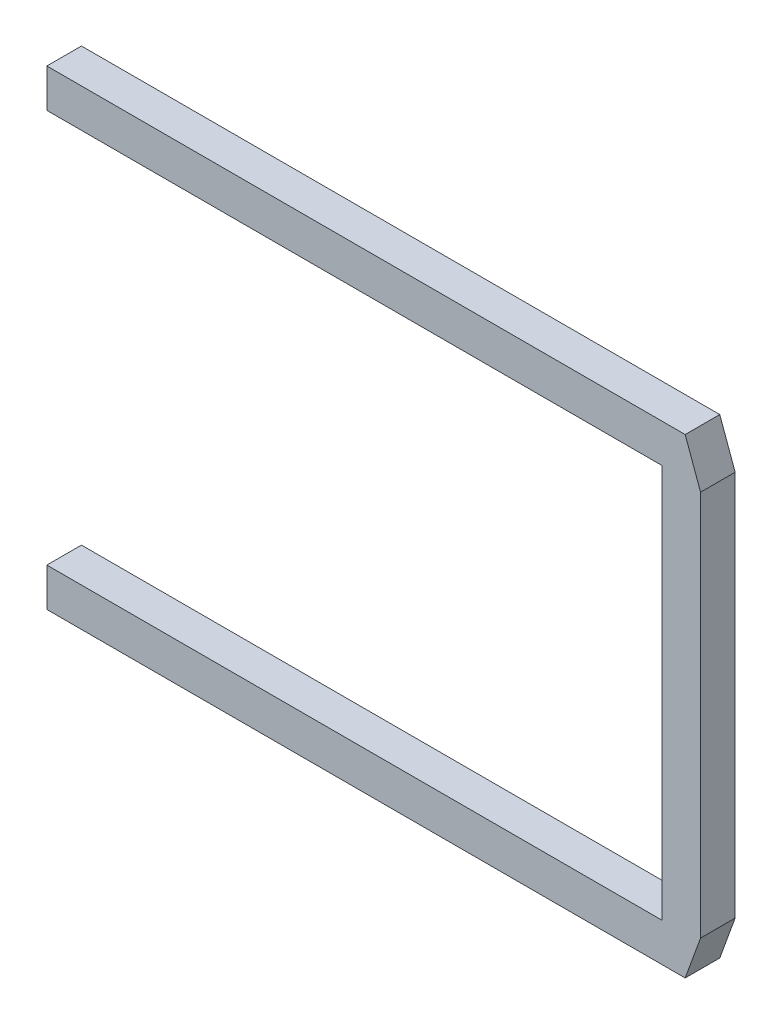
ISO-10303-21;
HEADER;
FILE_DESCRIPTION(('STEP AP214'),'2;1');
FILE_NAME('part.step','',(''),(''),'','','');
FILE_SCHEMA(('AUTOMOTIVE_DESIGN { 1 0 10303 214 1 1 1 1 }'));
ENDSEC;
DATA;
#1=APPLICATION_CONTEXT('core data for automotive mechanical design processes');
#2=APPLICATION_PROTOCOL_DEFINITION('international standard','automotive_design',2000,#1);
#3=PRODUCT_CONTEXT('',#1,'mechanical');
#4=PRODUCT('Part','Part','',(#3));
#5=PRODUCT_RELATED_PRODUCT_CATEGORY('part','',(#4));
#6=PRODUCT_DEFINITION_FORMATION('','',#4);
#7=PRODUCT_DEFINITION_CONTEXT('part definition',#1,'design');
#8=PRODUCT_DEFINITION('design','',#6,#7);
#9=PRODUCT_DEFINITION_SHAPE('','',#8);
#10=(LENGTH_UNIT() NAMED_UNIT(*) SI_UNIT(.MILLI.,.METRE.));
#11=(NAMED_UNIT(*) PLANE_ANGLE_UNIT() SI_UNIT($,.RADIAN.));
#12=(NAMED_UNIT(*) SI_UNIT($,.STERADIAN.) SOLID_ANGLE_UNIT());
#13=UNCERTAINTY_MEASURE_WITH_UNIT(LENGTH_MEASURE(1.E-05),#10,'distance_accuracy_value','');
#14=(GEOMETRIC_REPRESENTATION_CONTEXT(3) GLOBAL_UNCERTAINTY_ASSIGNED_CONTEXT((#13)) GLOBAL_UNIT_ASSIGNED_CONTEXT((#10,
#11,#12)) REPRESENTATION_CONTEXT('',''));
#15=CARTESIAN_POINT('',(0.,0.,0.));
#16=DIRECTION('',(0.,0.,1.));
#17=DIRECTION('',(1.,0.,0.));
#18=AXIS2_PLACEMENT_3D('',#15,#16,#17);
#19=CARTESIAN_POINT('',(42.5,30.6,4.5));
#20=DIRECTION('',(-1.,0.,0.));
#21=DIRECTION('',(0.,-1.,0.));
#22=AXIS2_PLACEMENT_3D('',#19,#20,#21);
#23=PLANE('',#22);
#24=DIRECTION('',(0.,1.,0.));
#25=VECTOR('',#24,1.);
#26=CARTESIAN_POINT('',(42.5,30.6,4.5));
#27=LINE('',#26,#25);
#28=CARTESIAN_POINT('',(42.5,-25.1050451610908,4.5));
#29=VERTEX_POINT('',#28);
#30=CARTESIAN_POINT('',(42.5,25.1050451610907,4.5));
#31=VERTEX_POINT('',#30);
#32=EDGE_CURVE('E118',#29,#31,#27,.T.);
#33=ORIENTED_EDGE('',*,*,#32,.F.);
#34=DIRECTION('',(0.,0.,-1.));
#35=VECTOR('',#34,1.);
#36=CARTESIAN_POINT('',(42.5,-25.1050451610908,4.5));
#37=LINE('',#36,#35);
#38=CARTESIAN_POINT('',(42.5,-25.1050451610908,0.));
#39=VERTEX_POINT('',#38);
#40=EDGE_CURVE('E176',#29,#39,#37,.T.);
#41=ORIENTED_EDGE('',*,*,#40,.T.);
#42=DIRECTION('',(0.,1.,0.));
#43=VECTOR('',#42,1.);
#44=CARTESIAN_POINT('',(42.5,30.6,0.));
#45=LINE('',#44,#43);
#46=CARTESIAN_POINT('',(42.5,25.1050451610907,0.));
#47=VERTEX_POINT('',#46);
#48=EDGE_CURVE('E147',#39,#47,#45,.T.);
#49=ORIENTED_EDGE('',*,*,#48,.T.);
#50=DIRECTION('',(0.,0.,1.));
#51=VECTOR('',#50,1.);
#52=CARTESIAN_POINT('',(42.5,25.1050451610907,4.5));
#53=LINE('',#52,#51);
#54=EDGE_CURVE('E127',#47,#31,#53,.T.);
#55=ORIENTED_EDGE('',*,*,#54,.T.);
#56=EDGE_LOOP('',(#33,#41,#49,#55));
#57=FACE_BOUND('',#56,.T.);
#58=ADVANCED_FACE('F33',(#57),#23,.F.);
#59=CARTESIAN_POINT('',(-42.5,30.6,4.5));
#60=DIRECTION('',(0.,-1.,0.));
#61=DIRECTION('',(0.,0.,-1.));
#62=AXIS2_PLACEMENT_3D('',#59,#60,#61);
#63=PLANE('',#62);
#64=DIRECTION('',(-1.,0.,0.));
#65=VECTOR('',#64,1.);
#66=CARTESIAN_POINT('',(-42.5,30.6,4.5));
#67=LINE('',#66,#65);
#68=CARTESIAN_POINT('',(40.5,30.6,4.5));
#69=VERTEX_POINT('',#68);
#70=CARTESIAN_POINT('',(-42.5,30.6,4.5));
#71=VERTEX_POINT('',#70);
#72=EDGE_CURVE('E110',#69,#71,#67,.T.);
#73=ORIENTED_EDGE('',*,*,#72,.F.);
#74=DIRECTION('',(0.,0.,-1.));
#75=VECTOR('',#74,1.);
#76=CARTESIAN_POINT('',(40.5,30.6,4.5));
#77=LINE('',#76,#75);
#78=CARTESIAN_POINT('',(40.5,30.6,0.));
#79=VERTEX_POINT('',#78);
#80=EDGE_CURVE('E11',#69,#79,#77,.T.);
#81=ORIENTED_EDGE('',*,*,#80,.T.);
#82=DIRECTION('',(-1.,0.,0.));
#83=VECTOR('',#82,1.);
#84=CARTESIAN_POINT('',(-42.5,30.6,0.));
#85=LINE('',#84,#83);
#86=CARTESIAN_POINT('',(-42.5,30.6,0.));
#87=VERTEX_POINT('',#86);
#88=EDGE_CURVE('E124',#79,#87,#85,.T.);
#89=ORIENTED_EDGE('',*,*,#88,.T.);
#90=DIRECTION('',(0.,0.,-1.));
#91=VECTOR('',#90,1.);
#92=CARTESIAN_POINT('',(-42.5,30.6,4.5));
#93=LINE('',#92,#91);
#94=EDGE_CURVE('E121',#71,#87,#93,.T.);
#95=ORIENTED_EDGE('',*,*,#94,.F.);
#96=EDGE_LOOP('',(#73,#81,#89,#95));
#97=FACE_BOUND('',#96,.T.);
#98=ADVANCED_FACE('F122',(#97),#63,.F.);
#99=CARTESIAN_POINT('',(-42.5,30.6,4.5));
#100=DIRECTION('',(1.,0.,0.));
#101=DIRECTION('',(0.,1.,0.));
#102=AXIS2_PLACEMENT_3D('',#99,#100,#101);
#103=PLANE('',#102);
#104=DIRECTION('',(0.,-1.,0.));
#105=VECTOR('',#104,1.);
#106=CARTESIAN_POINT('',(-42.5,30.6,0.));
#107=LINE('',#106,#105);
#108=CARTESIAN_POINT('',(-42.5,25.6,0.));
#109=VERTEX_POINT('',#108);
#110=EDGE_CURVE('E151',#87,#109,#107,.T.);
#111=ORIENTED_EDGE('',*,*,#110,.T.);
#112=DIRECTION('',(0.,0.,-1.));
#113=VECTOR('',#112,1.);
#114=CARTESIAN_POINT('',(-42.5,25.6,4.5));
#115=LINE('',#114,#113);
#116=CARTESIAN_POINT('',(-42.5,25.6,4.5));
#117=VERTEX_POINT('',#116);
#118=EDGE_CURVE('E128',#117,#109,#115,.T.);
#119=ORIENTED_EDGE('',*,*,#118,.F.);
#120=DIRECTION('',(0.,-1.,0.));
#121=VECTOR('',#120,1.);
#122=CARTESIAN_POINT('',(-42.5,30.6,4.5));
#123=LINE('',#122,#121);
#124=EDGE_CURVE('E114',#71,#117,#123,.T.);
#125=ORIENTED_EDGE('',*,*,#124,.F.);
#126=ORIENTED_EDGE('',*,*,#94,.T.);
#127=EDGE_LOOP('',(#111,#119,#125,#126));
#128=FACE_BOUND('',#127,.T.);
#129=ADVANCED_FACE('F130',(#128),#103,.F.);
#130=CARTESIAN_POINT('',(-42.5,25.6,4.5));
#131=DIRECTION('',(0.,1.,0.));
#132=DIRECTION('',(-1.,0.,0.));
#133=AXIS2_PLACEMENT_3D('',#130,#131,#132);
#134=PLANE('',#133);
#135=DIRECTION('',(1.,0.,0.));
#136=VECTOR('',#135,1.);
#137=CARTESIAN_POINT('',(-42.5,25.6,0.));
#138=LINE('',#137,#136);
#139=CARTESIAN_POINT('',(37.5,25.6,0.));
#140=VERTEX_POINT('',#139);
#141=EDGE_CURVE('E153',#109,#140,#138,.T.);
#142=ORIENTED_EDGE('',*,*,#141,.T.);
#143=DIRECTION('',(0.,0.,-1.));
#144=VECTOR('',#143,1.);
#145=CARTESIAN_POINT('',(37.5,25.6,4.5));
#146=LINE('',#145,#144);
#147=CARTESIAN_POINT('',(37.5,25.6,4.5));
#148=VERTEX_POINT('',#147);
#149=EDGE_CURVE('E171',#148,#140,#146,.T.);
#150=ORIENTED_EDGE('',*,*,#149,.F.);
#151=DIRECTION('',(1.,0.,0.));
#152=VECTOR('',#151,1.);
#153=CARTESIAN_POINT('',(-42.5,25.6,4.5));
#154=LINE('',#153,#152);
#155=EDGE_CURVE('E133',#117,#148,#154,.T.);
#156=ORIENTED_EDGE('',*,*,#155,.F.);
#157=ORIENTED_EDGE('',*,*,#118,.T.);
#158=EDGE_LOOP('',(#142,#150,#156,#157));
#159=FACE_BOUND('',#158,.T.);
#160=ADVANCED_FACE('F214',(#159),#134,.F.);
#161=CARTESIAN_POINT('',(37.5,25.6,4.5));
#162=DIRECTION('',(1.,0.,0.));
#163=DIRECTION('',(0.,0.,-1.));
#164=AXIS2_PLACEMENT_3D('',#161,#162,#163);
#165=PLANE('',#164);
#166=DIRECTION('',(0.,-1.,0.));
#167=VECTOR('',#166,1.);
#168=CARTESIAN_POINT('',(37.5,25.6,0.));
#169=LINE('',#168,#167);
#170=CARTESIAN_POINT('',(37.5,-25.6,0.));
#171=VERTEX_POINT('',#170);
#172=EDGE_CURVE('E155',#140,#171,#169,.T.);
#173=ORIENTED_EDGE('',*,*,#172,.T.);
#174=DIRECTION('',(0.,0.,-1.));
#175=VECTOR('',#174,1.);
#176=CARTESIAN_POINT('',(37.5,-25.6,4.5));
#177=LINE('',#176,#175);
#178=CARTESIAN_POINT('',(37.5,-25.6,4.5));
#179=VERTEX_POINT('',#178);
#180=EDGE_CURVE('E168',#179,#171,#177,.T.);
#181=ORIENTED_EDGE('',*,*,#180,.F.);
#182=DIRECTION('',(0.,-1.,0.));
#183=VECTOR('',#182,1.);
#184=CARTESIAN_POINT('',(37.5,25.6,4.5));
#185=LINE('',#184,#183);
#186=EDGE_CURVE('E135',#148,#179,#185,.T.);
#187=ORIENTED_EDGE('',*,*,#186,.F.);
#188=ORIENTED_EDGE('',*,*,#149,.T.);
#189=EDGE_LOOP('',(#173,#181,#187,#188));
#190=FACE_BOUND('',#189,.T.);
#191=ADVANCED_FACE('F211',(#190),#165,.F.);
#192=CARTESIAN_POINT('',(-42.5,-25.6,4.5));
#193=DIRECTION('',(0.,-1.,0.));
#194=DIRECTION('',(0.,0.,-1.));
#195=AXIS2_PLACEMENT_3D('',#192,#193,#194);
#196=PLANE('',#195);
#197=DIRECTION('',(-1.,0.,0.));
#198=VECTOR('',#197,1.);
#199=CARTESIAN_POINT('',(-42.5,-25.6,0.));
#200=LINE('',#199,#198);
#201=CARTESIAN_POINT('',(-42.5,-25.6,0.));
#202=VERTEX_POINT('',#201);
#203=EDGE_CURVE('E157',#171,#202,#200,.T.);
#204=ORIENTED_EDGE('',*,*,#203,.T.);
#205=DIRECTION('',(0.,0.,-1.));
#206=VECTOR('',#205,1.);
#207=CARTESIAN_POINT('',(-42.5,-25.6,4.5));
#208=LINE('',#207,#206);
#209=CARTESIAN_POINT('',(-42.5,-25.6,4.5));
#210=VERTEX_POINT('',#209);
#211=EDGE_CURVE('E165',#210,#202,#208,.T.);
#212=ORIENTED_EDGE('',*,*,#211,.F.);
#213=DIRECTION('',(-1.,0.,0.));
#214=VECTOR('',#213,1.);
#215=CARTESIAN_POINT('',(-42.5,-25.6,4.5));
#216=LINE('',#215,#214);
#217=EDGE_CURVE('E140',#179,#210,#216,.T.);
#218=ORIENTED_EDGE('',*,*,#217,.F.);
#219=ORIENTED_EDGE('',*,*,#180,.T.);
#220=EDGE_LOOP('',(#204,#212,#218,#219));
#221=FACE_BOUND('',#220,.T.);
#222=ADVANCED_FACE('F206',(#221),#196,.F.);
#223=CARTESIAN_POINT('',(-42.5,-25.6,4.5));
#224=DIRECTION('',(1.,0.,0.));
#225=DIRECTION('',(0.,1.,0.));
#226=AXIS2_PLACEMENT_3D('',#223,#224,#225);
#227=PLANE('',#226);
#228=DIRECTION('',(0.,-1.,0.));
#229=VECTOR('',#228,1.);
#230=CARTESIAN_POINT('',(-42.5,-25.6,0.));
#231=LINE('',#230,#229);
#232=CARTESIAN_POINT('',(-42.5,-30.6,0.));
#233=VERTEX_POINT('',#232);
#234=EDGE_CURVE('E159',#202,#233,#231,.T.);
#235=ORIENTED_EDGE('',*,*,#234,.T.);
#236=DIRECTION('',(0.,0.,-1.));
#237=VECTOR('',#236,1.);
#238=CARTESIAN_POINT('',(-42.5,-30.6,4.5));
#239=LINE('',#238,#237);
#240=CARTESIAN_POINT('',(-42.5,-30.6,4.5));
#241=VERTEX_POINT('',#240);
#242=EDGE_CURVE('E146',#241,#233,#239,.T.);
#243=ORIENTED_EDGE('',*,*,#242,.F.);
#244=DIRECTION('',(0.,-1.,0.));
#245=VECTOR('',#244,1.);
#246=CARTESIAN_POINT('',(-42.5,-25.6,4.5));
#247=LINE('',#246,#245);
#248=EDGE_CURVE('E142',#210,#241,#247,.T.);
#249=ORIENTED_EDGE('',*,*,#248,.F.);
#250=ORIENTED_EDGE('',*,*,#211,.T.);
#251=EDGE_LOOP('',(#235,#243,#249,#250));
#252=FACE_BOUND('',#251,.T.);
#253=ADVANCED_FACE('F200',(#252),#227,.F.);
#254=CARTESIAN_POINT('',(-42.5,-30.6,4.5));
#255=DIRECTION('',(0.,1.,0.));
#256=DIRECTION('',(0.,0.,1.));
#257=AXIS2_PLACEMENT_3D('',#254,#255,#256);
#258=PLANE('',#257);
#259=DIRECTION('',(1.,0.,0.));
#260=VECTOR('',#259,1.);
#261=CARTESIAN_POINT('',(-42.5,-30.6,0.));
#262=LINE('',#261,#260);
#263=CARTESIAN_POINT('',(40.5,-30.6,0.));
#264=VERTEX_POINT('',#263);
#265=EDGE_CURVE('E161',#233,#264,#262,.T.);
#266=ORIENTED_EDGE('',*,*,#265,.T.);
#267=DIRECTION('',(0.,0.,1.));
#268=VECTOR('',#267,1.);
#269=CARTESIAN_POINT('',(40.5,-30.6,4.5));
#270=LINE('',#269,#268);
#271=CARTESIAN_POINT('',(40.5,-30.6,4.5));
#272=VERTEX_POINT('',#271);
#273=EDGE_CURVE('E56',#264,#272,#270,.T.);
#274=ORIENTED_EDGE('',*,*,#273,.T.);
#275=DIRECTION('',(1.,0.,0.));
#276=VECTOR('',#275,1.);
#277=CARTESIAN_POINT('',(-42.5,-30.6,4.5));
#278=LINE('',#277,#276);
#279=EDGE_CURVE('E144',#241,#272,#278,.T.);
#280=ORIENTED_EDGE('',*,*,#279,.F.);
#281=ORIENTED_EDGE('',*,*,#242,.T.);
#282=EDGE_LOOP('',(#266,#274,#280,#281));
#283=FACE_BOUND('',#282,.T.);
#284=ADVANCED_FACE('F196',(#283),#258,.F.);
#285=CARTESIAN_POINT('',(0.,0.,4.5));
#286=DIRECTION('',(0.,0.,1.));
#287=DIRECTION('',(1.,0.,0.));
#288=AXIS2_PLACEMENT_3D('',#285,#286,#287);
#289=PLANE('',#288);
#290=ORIENTED_EDGE('',*,*,#279,.T.);
#291=DIRECTION('',(-0.342020143325667,-0.939692620785909,0.));
#292=VECTOR('',#291,1.);
#293=CARTESIAN_POINT('',(45.5970504013634,-16.595969116432,4.5));
#294=LINE('',#293,#292);
#295=EDGE_CURVE('E41',#272,#29,#294,.F.);
#296=ORIENTED_EDGE('',*,*,#295,.T.);
#297=ORIENTED_EDGE('',*,*,#32,.T.);
#298=DIRECTION('',(0.342020143325668,-0.939692620785909,0.));
#299=VECTOR('',#298,1.);
#300=CARTESIAN_POINT('',(45.5970504013634,16.595969116432,4.5));
#301=LINE('',#300,#299);
#302=EDGE_CURVE('E48',#31,#69,#301,.F.);
#303=ORIENTED_EDGE('',*,*,#302,.T.);
#304=ORIENTED_EDGE('',*,*,#72,.T.);
#305=ORIENTED_EDGE('',*,*,#124,.T.);
#306=ORIENTED_EDGE('',*,*,#155,.T.);
#307=ORIENTED_EDGE('',*,*,#186,.T.);
#308=ORIENTED_EDGE('',*,*,#217,.T.);
#309=ORIENTED_EDGE('',*,*,#248,.T.);
#310=EDGE_LOOP('',(#290,#296,#297,#303,#304,#305,#306,#307,#308,#309));
#311=FACE_BOUND('',#310,.T.);
#312=ADVANCED_FACE('F112',(#311),#289,.T.);
#313=CARTESIAN_POINT('',(0.,0.,0.));
#314=DIRECTION('',(0.,0.,1.));
#315=DIRECTION('',(1.,0.,0.));
#316=AXIS2_PLACEMENT_3D('',#313,#314,#315);
#317=PLANE('',#316);
#318=ORIENTED_EDGE('',*,*,#48,.F.);
#319=DIRECTION('',(0.342020143325667,0.939692620785909,0.));
#320=VECTOR('',#319,1.);
#321=CARTESIAN_POINT('',(42.5,-25.1050451610908,0.));
#322=LINE('',#321,#320);
#323=EDGE_CURVE('E181',#39,#264,#322,.F.);
#324=ORIENTED_EDGE('',*,*,#323,.T.);
#325=ORIENTED_EDGE('',*,*,#265,.F.);
#326=ORIENTED_EDGE('',*,*,#234,.F.);
#327=ORIENTED_EDGE('',*,*,#203,.F.);
#328=ORIENTED_EDGE('',*,*,#172,.F.);
#329=ORIENTED_EDGE('',*,*,#141,.F.);
#330=ORIENTED_EDGE('',*,*,#110,.F.);
#331=ORIENTED_EDGE('',*,*,#88,.F.);
#332=DIRECTION('',(-0.342020143325668,0.939692620785909,0.));
#333=VECTOR('',#332,1.);
#334=CARTESIAN_POINT('',(40.5,30.6,0.));
#335=LINE('',#334,#333);
#336=EDGE_CURVE('E179',#79,#47,#335,.F.);
#337=ORIENTED_EDGE('',*,*,#336,.T.);
#338=EDGE_LOOP('',(#318,#324,#325,#326,#327,#328,#329,#330,#331,#337));
#339=FACE_BOUND('',#338,.T.);
#340=ADVANCED_FACE('F194',(#339),#317,.F.);
#341=CARTESIAN_POINT('',(42.5,-25.1050451610908,4.5));
#342=DIRECTION('',(-0.939692620785909,0.342020143325667,0.));
#343=DIRECTION('',(0.,0.,-1.));
#344=AXIS2_PLACEMENT_3D('',#341,#342,#343);
#345=PLANE('',#344);
#346=ORIENTED_EDGE('',*,*,#295,.F.);
#347=ORIENTED_EDGE('',*,*,#273,.F.);
#348=ORIENTED_EDGE('',*,*,#323,.F.);
#349=ORIENTED_EDGE('',*,*,#40,.F.);
#350=EDGE_LOOP('',(#346,#347,#348,#349));
#351=FACE_BOUND('',#350,.T.);
#352=ADVANCED_FACE('F191',(#351),#345,.F.);
#353=CARTESIAN_POINT('',(40.5,30.6,4.5));
#354=DIRECTION('',(-0.939692620785909,-0.342020143325668,0.));
#355=DIRECTION('',(0.,0.,-1.));
#356=AXIS2_PLACEMENT_3D('',#353,#354,#355);
#357=PLANE('',#356);
#358=ORIENTED_EDGE('',*,*,#302,.F.);
#359=ORIENTED_EDGE('',*,*,#54,.F.);
#360=ORIENTED_EDGE('',*,*,#336,.F.);
#361=ORIENTED_EDGE('',*,*,#80,.F.);
#362=EDGE_LOOP('',(#358,#359,#360,#361));
#363=FACE_BOUND('',#362,.T.);
#364=ADVANCED_FACE('F35',(#363),#357,.F.);
#365=CLOSED_SHELL('',(#58,#98,#129,#160,#191,#222,#253,#284,#312,#340,#352,#364));
#366=MANIFOLD_SOLID_BREP('B2',#365);
#367=ADVANCED_BREP_SHAPE_REPRESENTATION('',(#18,#366),#14);
#368=SHAPE_DEFINITION_REPRESENTATION(#9,#367);
ENDSEC;
END-ISO-10303-21;
